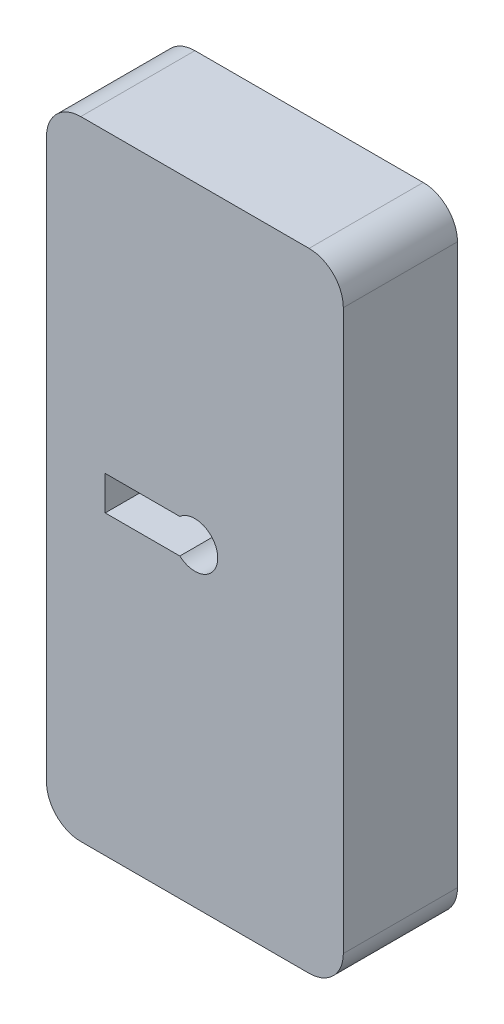
ISO-10303-21;
HEADER;
FILE_DESCRIPTION(('STEP AP214'),'2;1');
FILE_NAME('part.step','',(''),(''),'','','');
FILE_SCHEMA(('AUTOMOTIVE_DESIGN { 1 0 10303 214 1 1 1 1 }'));
ENDSEC;
DATA;
#1=APPLICATION_CONTEXT('core data for automotive mechanical design processes');
#2=APPLICATION_PROTOCOL_DEFINITION('international standard','automotive_design',2000,#1);
#3=PRODUCT_CONTEXT('',#1,'mechanical');
#4=PRODUCT('Part','Part','',(#3));
#5=PRODUCT_RELATED_PRODUCT_CATEGORY('part','',(#4));
#6=PRODUCT_DEFINITION_FORMATION('','',#4);
#7=PRODUCT_DEFINITION_CONTEXT('part definition',#1,'design');
#8=PRODUCT_DEFINITION('design','',#6,#7);
#9=PRODUCT_DEFINITION_SHAPE('','',#8);
#10=(LENGTH_UNIT() NAMED_UNIT(*) SI_UNIT(.MILLI.,.METRE.));
#11=(NAMED_UNIT(*) PLANE_ANGLE_UNIT() SI_UNIT($,.RADIAN.));
#12=(NAMED_UNIT(*) SI_UNIT($,.STERADIAN.) SOLID_ANGLE_UNIT());
#13=UNCERTAINTY_MEASURE_WITH_UNIT(LENGTH_MEASURE(1.E-05),#10,'distance_accuracy_value','');
#14=(GEOMETRIC_REPRESENTATION_CONTEXT(3) GLOBAL_UNCERTAINTY_ASSIGNED_CONTEXT((#13)) GLOBAL_UNIT_ASSIGNED_CONTEXT((#10,
#11,#12)) REPRESENTATION_CONTEXT('',''));
#15=CARTESIAN_POINT('',(0.,0.,0.));
#16=DIRECTION('',(0.,0.,1.));
#17=DIRECTION('',(1.,0.,0.));
#18=AXIS2_PLACEMENT_3D('',#15,#16,#17);
#19=CARTESIAN_POINT('',(-9.99999999999999,4.50000000000001,10.));
#20=DIRECTION('',(0.,0.,-1.));
#21=DIRECTION('',(-1.,0.,0.));
#22=AXIS2_PLACEMENT_3D('',#19,#20,#21);
#23=CYLINDRICAL_SURFACE('',#22,3.);
#24=CARTESIAN_POINT('',(-9.99999999999999,4.50000000000001,0.));
#25=DIRECTION('',(0.,0.,1.));
#26=DIRECTION('',(-1.,0.,0.));
#27=AXIS2_PLACEMENT_3D('',#24,#25,#26);
#28=CIRCLE('',#27,3.);
#29=CARTESIAN_POINT('',(-9.99999999999999,7.50000000000001,0.));
#30=VERTEX_POINT('',#29);
#31=CARTESIAN_POINT('',(-13.,4.5,0.));
#32=VERTEX_POINT('',#31);
#33=EDGE_CURVE('E185',#30,#32,#28,.T.);
#34=ORIENTED_EDGE('',*,*,#33,.T.);
#35=DIRECTION('',(0.,0.,-1.));
#36=VECTOR('',#35,1.);
#37=CARTESIAN_POINT('',(-13.,4.5,10.));
#38=LINE('',#37,#36);
#39=CARTESIAN_POINT('',(-13.,4.5,10.));
#40=VERTEX_POINT('',#39);
#41=EDGE_CURVE('E241',#40,#32,#38,.T.);
#42=ORIENTED_EDGE('',*,*,#41,.F.);
#43=CARTESIAN_POINT('',(-9.99999999999999,4.50000000000001,10.));
#44=DIRECTION('',(0.,0.,1.));
#45=DIRECTION('',(-1.,0.,0.));
#46=AXIS2_PLACEMENT_3D('',#43,#44,#45);
#47=CIRCLE('',#46,3.);
#48=CARTESIAN_POINT('',(-9.99999999999999,7.50000000000001,10.));
#49=VERTEX_POINT('',#48);
#50=EDGE_CURVE('E187',#49,#40,#47,.T.);
#51=ORIENTED_EDGE('',*,*,#50,.F.);
#52=DIRECTION('',(0.,0.,-1.));
#53=VECTOR('',#52,1.);
#54=CARTESIAN_POINT('',(-9.99999999999999,7.50000000000001,10.));
#55=LINE('',#54,#53);
#56=EDGE_CURVE('E205',#49,#30,#55,.T.);
#57=ORIENTED_EDGE('',*,*,#56,.T.);
#58=EDGE_LOOP('',(#34,#42,#51,#57));
#59=FACE_BOUND('',#58,.T.);
#60=ADVANCED_FACE('F38',(#59),#23,.T.);
#61=CARTESIAN_POINT('',(-13.,-44.5,10.));
#62=DIRECTION('',(1.,0.,0.));
#63=DIRECTION('',(0.,0.,-1.));
#64=AXIS2_PLACEMENT_3D('',#61,#62,#63);
#65=PLANE('',#64);
#66=DIRECTION('',(0.,-1.,0.));
#67=VECTOR('',#66,1.);
#68=CARTESIAN_POINT('',(-13.,-44.5,0.));
#69=LINE('',#68,#67);
#70=CARTESIAN_POINT('',(-13.,-44.5,0.));
#71=VERTEX_POINT('',#70);
#72=EDGE_CURVE('E208',#32,#71,#69,.T.);
#73=ORIENTED_EDGE('',*,*,#72,.T.);
#74=DIRECTION('',(0.,0.,-1.));
#75=VECTOR('',#74,1.);
#76=CARTESIAN_POINT('',(-13.,-44.5,10.));
#77=LINE('',#76,#75);
#78=CARTESIAN_POINT('',(-13.,-44.5,10.));
#79=VERTEX_POINT('',#78);
#80=EDGE_CURVE('E238',#79,#71,#77,.T.);
#81=ORIENTED_EDGE('',*,*,#80,.F.);
#82=DIRECTION('',(0.,-1.,0.));
#83=VECTOR('',#82,1.);
#84=CARTESIAN_POINT('',(-13.,-44.5,10.));
#85=LINE('',#84,#83);
#86=EDGE_CURVE('E190',#40,#79,#85,.T.);
#87=ORIENTED_EDGE('',*,*,#86,.F.);
#88=ORIENTED_EDGE('',*,*,#41,.T.);
#89=EDGE_LOOP('',(#73,#81,#87,#88));
#90=FACE_BOUND('',#89,.T.);
#91=ADVANCED_FACE('F270',(#90),#65,.F.);
#92=CARTESIAN_POINT('',(-9.99999999999999,-44.5,10.));
#93=DIRECTION('',(0.,0.,-1.));
#94=DIRECTION('',(-1.,0.,0.));
#95=AXIS2_PLACEMENT_3D('',#92,#93,#94);
#96=CYLINDRICAL_SURFACE('',#95,3.);
#97=CARTESIAN_POINT('',(-9.99999999999999,-44.5,0.));
#98=DIRECTION('',(0.,0.,1.));
#99=DIRECTION('',(1.,0.,0.));
#100=AXIS2_PLACEMENT_3D('',#97,#98,#99);
#101=CIRCLE('',#100,3.);
#102=CARTESIAN_POINT('',(-9.99999999999999,-47.5,0.));
#103=VERTEX_POINT('',#102);
#104=EDGE_CURVE('E210',#71,#103,#101,.T.);
#105=ORIENTED_EDGE('',*,*,#104,.T.);
#106=DIRECTION('',(0.,0.,-1.));
#107=VECTOR('',#106,1.);
#108=CARTESIAN_POINT('',(-9.99999999999999,-47.5,10.));
#109=LINE('',#108,#107);
#110=CARTESIAN_POINT('',(-9.99999999999999,-47.5,10.));
#111=VERTEX_POINT('',#110);
#112=EDGE_CURVE('E235',#111,#103,#109,.T.);
#113=ORIENTED_EDGE('',*,*,#112,.F.);
#114=CARTESIAN_POINT('',(-9.99999999999999,-44.5,10.));
#115=DIRECTION('',(0.,0.,1.));
#116=DIRECTION('',(1.,0.,0.));
#117=AXIS2_PLACEMENT_3D('',#114,#115,#116);
#118=CIRCLE('',#117,3.);
#119=EDGE_CURVE('E193',#79,#111,#118,.T.);
#120=ORIENTED_EDGE('',*,*,#119,.F.);
#121=ORIENTED_EDGE('',*,*,#80,.T.);
#122=EDGE_LOOP('',(#105,#113,#120,#121));
#123=FACE_BOUND('',#122,.T.);
#124=ADVANCED_FACE('F276',(#123),#96,.T.);
#125=CARTESIAN_POINT('',(-9.99999999999999,-47.5,10.));
#126=DIRECTION('',(0.,1.,0.));
#127=DIRECTION('',(0.,0.,1.));
#128=AXIS2_PLACEMENT_3D('',#125,#126,#127);
#129=PLANE('',#128);
#130=DIRECTION('',(1.,0.,0.));
#131=VECTOR('',#130,1.);
#132=CARTESIAN_POINT('',(-9.99999999999999,-47.5,0.));
#133=LINE('',#132,#131);
#134=CARTESIAN_POINT('',(10.,-47.5,0.));
#135=VERTEX_POINT('',#134);
#136=EDGE_CURVE('E212',#103,#135,#133,.T.);
#137=ORIENTED_EDGE('',*,*,#136,.T.);
#138=DIRECTION('',(0.,0.,-1.));
#139=VECTOR('',#138,1.);
#140=CARTESIAN_POINT('',(10.,-47.5,10.));
#141=LINE('',#140,#139);
#142=CARTESIAN_POINT('',(10.,-47.5,10.));
#143=VERTEX_POINT('',#142);
#144=EDGE_CURVE('E232',#143,#135,#141,.T.);
#145=ORIENTED_EDGE('',*,*,#144,.F.);
#146=DIRECTION('',(1.,0.,0.));
#147=VECTOR('',#146,1.);
#148=CARTESIAN_POINT('',(-9.99999999999999,-47.5,10.));
#149=LINE('',#148,#147);
#150=EDGE_CURVE('E195',#111,#143,#149,.T.);
#151=ORIENTED_EDGE('',*,*,#150,.F.);
#152=ORIENTED_EDGE('',*,*,#112,.T.);
#153=EDGE_LOOP('',(#137,#145,#151,#152));
#154=FACE_BOUND('',#153,.T.);
#155=ADVANCED_FACE('F282',(#154),#129,.F.);
#156=CARTESIAN_POINT('',(10.,-44.5,10.));
#157=DIRECTION('',(0.,0.,-1.));
#158=DIRECTION('',(-1.,0.,0.));
#159=AXIS2_PLACEMENT_3D('',#156,#157,#158);
#160=CYLINDRICAL_SURFACE('',#159,3.);
#161=CARTESIAN_POINT('',(10.,-44.5,0.));
#162=DIRECTION('',(0.,0.,1.));
#163=DIRECTION('',(-1.,0.,0.));
#164=AXIS2_PLACEMENT_3D('',#161,#162,#163);
#165=CIRCLE('',#164,3.);
#166=CARTESIAN_POINT('',(13.,-44.5,0.));
#167=VERTEX_POINT('',#166);
#168=EDGE_CURVE('E214',#135,#167,#165,.T.);
#169=ORIENTED_EDGE('',*,*,#168,.T.);
#170=DIRECTION('',(0.,0.,-1.));
#171=VECTOR('',#170,1.);
#172=CARTESIAN_POINT('',(13.,-44.5,10.));
#173=LINE('',#172,#171);
#174=CARTESIAN_POINT('',(13.,-44.5,10.));
#175=VERTEX_POINT('',#174);
#176=EDGE_CURVE('E229',#175,#167,#173,.T.);
#177=ORIENTED_EDGE('',*,*,#176,.F.);
#178=CARTESIAN_POINT('',(10.,-44.5,10.));
#179=DIRECTION('',(0.,0.,1.));
#180=DIRECTION('',(-1.,0.,0.));
#181=AXIS2_PLACEMENT_3D('',#178,#179,#180);
#182=CIRCLE('',#181,3.);
#183=EDGE_CURVE('E197',#143,#175,#182,.T.);
#184=ORIENTED_EDGE('',*,*,#183,.F.);
#185=ORIENTED_EDGE('',*,*,#144,.T.);
#186=EDGE_LOOP('',(#169,#177,#184,#185));
#187=FACE_BOUND('',#186,.T.);
#188=ADVANCED_FACE('F286',(#187),#160,.T.);
#189=CARTESIAN_POINT('',(13.,-44.5,10.));
#190=DIRECTION('',(-1.,0.,0.));
#191=DIRECTION('',(0.,0.,1.));
#192=AXIS2_PLACEMENT_3D('',#189,#190,#191);
#193=PLANE('',#192);
#194=DIRECTION('',(0.,1.,0.));
#195=VECTOR('',#194,1.);
#196=CARTESIAN_POINT('',(13.,-44.5,0.));
#197=LINE('',#196,#195);
#198=CARTESIAN_POINT('',(13.,4.5,0.));
#199=VERTEX_POINT('',#198);
#200=EDGE_CURVE('E216',#167,#199,#197,.T.);
#201=ORIENTED_EDGE('',*,*,#200,.T.);
#202=DIRECTION('',(0.,0.,-1.));
#203=VECTOR('',#202,1.);
#204=CARTESIAN_POINT('',(13.,4.5,10.));
#205=LINE('',#204,#203);
#206=CARTESIAN_POINT('',(13.,4.5,10.));
#207=VERTEX_POINT('',#206);
#208=EDGE_CURVE('E226',#207,#199,#205,.T.);
#209=ORIENTED_EDGE('',*,*,#208,.F.);
#210=DIRECTION('',(0.,1.,0.));
#211=VECTOR('',#210,1.);
#212=CARTESIAN_POINT('',(13.,-44.5,10.));
#213=LINE('',#212,#211);
#214=EDGE_CURVE('E199',#175,#207,#213,.T.);
#215=ORIENTED_EDGE('',*,*,#214,.F.);
#216=ORIENTED_EDGE('',*,*,#176,.T.);
#217=EDGE_LOOP('',(#201,#209,#215,#216));
#218=FACE_BOUND('',#217,.T.);
#219=ADVANCED_FACE('F290',(#218),#193,.F.);
#220=CARTESIAN_POINT('',(10.,4.50000000000001,10.));
#221=DIRECTION('',(0.,0.,-1.));
#222=DIRECTION('',(-1.,0.,0.));
#223=AXIS2_PLACEMENT_3D('',#220,#221,#222);
#224=CYLINDRICAL_SURFACE('',#223,3.);
#225=CARTESIAN_POINT('',(10.,4.50000000000001,0.));
#226=DIRECTION('',(0.,0.,1.));
#227=DIRECTION('',(-1.,0.,0.));
#228=AXIS2_PLACEMENT_3D('',#225,#226,#227);
#229=CIRCLE('',#228,3.);
#230=CARTESIAN_POINT('',(10.,7.50000000000001,0.));
#231=VERTEX_POINT('',#230);
#232=EDGE_CURVE('E218',#199,#231,#229,.T.);
#233=ORIENTED_EDGE('',*,*,#232,.T.);
#234=DIRECTION('',(0.,0.,-1.));
#235=VECTOR('',#234,1.);
#236=CARTESIAN_POINT('',(10.,7.50000000000001,10.));
#237=LINE('',#236,#235);
#238=CARTESIAN_POINT('',(10.,7.50000000000001,10.));
#239=VERTEX_POINT('',#238);
#240=EDGE_CURVE('E223',#239,#231,#237,.T.);
#241=ORIENTED_EDGE('',*,*,#240,.F.);
#242=CARTESIAN_POINT('',(10.,4.50000000000001,10.));
#243=DIRECTION('',(0.,0.,1.));
#244=DIRECTION('',(-1.,0.,0.));
#245=AXIS2_PLACEMENT_3D('',#242,#243,#244);
#246=CIRCLE('',#245,3.);
#247=EDGE_CURVE('E201',#207,#239,#246,.T.);
#248=ORIENTED_EDGE('',*,*,#247,.F.);
#249=ORIENTED_EDGE('',*,*,#208,.T.);
#250=EDGE_LOOP('',(#233,#241,#248,#249));
#251=FACE_BOUND('',#250,.T.);
#252=ADVANCED_FACE('F294',(#251),#224,.T.);
#253=CARTESIAN_POINT('',(-9.99999999999999,7.50000000000001,10.));
#254=DIRECTION('',(0.,-1.,0.));
#255=DIRECTION('',(0.,0.,-1.));
#256=AXIS2_PLACEMENT_3D('',#253,#254,#255);
#257=PLANE('',#256);
#258=DIRECTION('',(-1.,0.,0.));
#259=VECTOR('',#258,1.);
#260=CARTESIAN_POINT('',(-9.99999999999999,7.50000000000001,0.));
#261=LINE('',#260,#259);
#262=EDGE_CURVE('E191',#231,#30,#261,.T.);
#263=ORIENTED_EDGE('',*,*,#262,.T.);
#264=ORIENTED_EDGE('',*,*,#56,.F.);
#265=DIRECTION('',(-1.,0.,0.));
#266=VECTOR('',#265,1.);
#267=CARTESIAN_POINT('',(-9.99999999999999,7.50000000000001,10.));
#268=LINE('',#267,#266);
#269=EDGE_CURVE('E203',#239,#49,#268,.T.);
#270=ORIENTED_EDGE('',*,*,#269,.F.);
#271=ORIENTED_EDGE('',*,*,#240,.T.);
#272=EDGE_LOOP('',(#263,#264,#270,#271));
#273=FACE_BOUND('',#272,.T.);
#274=ADVANCED_FACE('F298',(#273),#257,.F.);
#275=CARTESIAN_POINT('',(-9.99999999999999,4.50000000000001,10.));
#276=DIRECTION('',(0.,0.,-1.));
#277=DIRECTION('',(-1.,0.,0.));
#278=AXIS2_PLACEMENT_3D('',#275,#276,#277);
#279=PLANE('',#278);
#280=DIRECTION('',(0.,-1.,0.));
#281=VECTOR('',#280,1.);
#282=CARTESIAN_POINT('',(-7.85811682286003,-18.5,10.));
#283=LINE('',#282,#281);
#284=CARTESIAN_POINT('',(-7.85811682286003,-18.5,10.));
#285=VERTEX_POINT('',#284);
#286=CARTESIAN_POINT('',(-7.85811682286003,-21.5,10.));
#287=VERTEX_POINT('',#286);
#288=EDGE_CURVE('E165',#285,#287,#283,.T.);
#289=ORIENTED_EDGE('',*,*,#288,.F.);
#290=DIRECTION('',(-1.,0.,0.));
#291=VECTOR('',#290,1.);
#292=CARTESIAN_POINT('',(-1.32287565553224,-18.5,10.));
#293=LINE('',#292,#291);
#294=CARTESIAN_POINT('',(-1.32287565553224,-18.5,10.));
#295=VERTEX_POINT('',#294);
#296=EDGE_CURVE('E156',#295,#285,#293,.T.);
#297=ORIENTED_EDGE('',*,*,#296,.F.);
#298=CARTESIAN_POINT('',(0.,-20.,10.));
#299=DIRECTION('',(0.,0.,1.));
#300=DIRECTION('',(1.,0.,0.));
#301=AXIS2_PLACEMENT_3D('',#298,#299,#300);
#302=CIRCLE('',#301,1.99999999999997);
#303=CARTESIAN_POINT('',(-1.32287565553224,-21.5,10.));
#304=VERTEX_POINT('',#303);
#305=EDGE_CURVE('E169',#304,#295,#302,.T.);
#306=ORIENTED_EDGE('',*,*,#305,.F.);
#307=DIRECTION('',(1.,0.,0.));
#308=VECTOR('',#307,1.);
#309=CARTESIAN_POINT('',(-7.85811682286003,-21.5,10.));
#310=LINE('',#309,#308);
#311=EDGE_CURVE('E53',#287,#304,#310,.T.);
#312=ORIENTED_EDGE('',*,*,#311,.F.);
#313=EDGE_LOOP('',(#289,#297,#306,#312));
#314=FACE_BOUND('',#313,.T.);
#315=ORIENTED_EDGE('',*,*,#50,.T.);
#316=ORIENTED_EDGE('',*,*,#86,.T.);
#317=ORIENTED_EDGE('',*,*,#119,.T.);
#318=ORIENTED_EDGE('',*,*,#150,.T.);
#319=ORIENTED_EDGE('',*,*,#183,.T.);
#320=ORIENTED_EDGE('',*,*,#214,.T.);
#321=ORIENTED_EDGE('',*,*,#247,.T.);
#322=ORIENTED_EDGE('',*,*,#269,.T.);
#323=EDGE_LOOP('',(#315,#316,#317,#318,#319,#320,#321,#322));
#324=FACE_BOUND('',#323,.T.);
#325=ADVANCED_FACE('F302',(#314,#324),#279,.F.);
#326=CARTESIAN_POINT('',(-9.99999999999999,4.50000000000001,0.));
#327=DIRECTION('',(0.,0.,-1.));
#328=DIRECTION('',(-1.,0.,0.));
#329=AXIS2_PLACEMENT_3D('',#326,#327,#328);
#330=PLANE('',#329);
#331=CARTESIAN_POINT('',(-1.08081316866238E-13,-5.5000000000001,0.));
#332=DIRECTION('',(0.,0.,-1.));
#333=DIRECTION('',(-1.,0.,0.));
#334=AXIS2_PLACEMENT_3D('',#331,#332,#333);
#335=CIRCLE('',#334,1.64999999977116);
#336=CARTESIAN_POINT('',(-1.64999999977127,-5.5000000000001,0.));
#337=VERTEX_POINT('',#336);
#338=EDGE_CURVE('E342',#337,#337,#335,.T.);
#339=ORIENTED_EDGE('',*,*,#338,.F.);
#340=EDGE_LOOP('',(#339));
#341=FACE_BOUND('',#340,.T.);
#342=CARTESIAN_POINT('',(-1.08081316866238E-13,-9.0000000000001,0.));
#343=DIRECTION('',(0.,0.,-1.));
#344=DIRECTION('',(-1.,0.,0.));
#345=AXIS2_PLACEMENT_3D('',#342,#343,#344);
#346=CIRCLE('',#345,1.64999999977116);
#347=CARTESIAN_POINT('',(-1.64999999977127,-9.0000000000001,0.));
#348=VERTEX_POINT('',#347);
#349=EDGE_CURVE('E343',#348,#348,#346,.T.);
#350=ORIENTED_EDGE('',*,*,#349,.F.);
#351=EDGE_LOOP('',(#350));
#352=FACE_BOUND('',#351,.T.);
#353=CARTESIAN_POINT('',(-1.08509943245928E-13,-12.5000000000001,0.));
#354=DIRECTION('',(0.,0.,-1.));
#355=DIRECTION('',(-1.,0.,0.));
#356=AXIS2_PLACEMENT_3D('',#353,#354,#355);
#357=CIRCLE('',#356,1.64999999977116);
#358=CARTESIAN_POINT('',(-1.64999999977127,-12.5000000000001,0.));
#359=VERTEX_POINT('',#358);
#360=EDGE_CURVE('E346',#359,#359,#357,.T.);
#361=ORIENTED_EDGE('',*,*,#360,.F.);
#362=EDGE_LOOP('',(#361));
#363=FACE_BOUND('',#362,.T.);
#364=DIRECTION('',(-1.,0.,0.));
#365=VECTOR('',#364,1.);
#366=CARTESIAN_POINT('',(-1.32287565553224,-18.5,0.));
#367=LINE('',#366,#365);
#368=CARTESIAN_POINT('',(-3.70809924354796,-18.5,0.));
#369=VERTEX_POINT('',#368);
#370=CARTESIAN_POINT('',(-7.85811682286003,-18.5,0.));
#371=VERTEX_POINT('',#370);
#372=EDGE_CURVE('E153',#369,#371,#367,.T.);
#373=ORIENTED_EDGE('',*,*,#372,.T.);
#374=DIRECTION('',(0.,-1.,0.));
#375=VECTOR('',#374,1.);
#376=CARTESIAN_POINT('',(-7.85811682286003,-18.5,0.));
#377=LINE('',#376,#375);
#378=CARTESIAN_POINT('',(-7.85811682286003,-21.5,0.));
#379=VERTEX_POINT('',#378);
#380=EDGE_CURVE('E140',#371,#379,#377,.T.);
#381=ORIENTED_EDGE('',*,*,#380,.T.);
#382=DIRECTION('',(1.,0.,0.));
#383=VECTOR('',#382,1.);
#384=CARTESIAN_POINT('',(-7.85811682286003,-21.5,0.));
#385=LINE('',#384,#383);
#386=CARTESIAN_POINT('',(-3.70809924354796,-21.5,0.));
#387=VERTEX_POINT('',#386);
#388=EDGE_CURVE('E171',#379,#387,#385,.T.);
#389=ORIENTED_EDGE('',*,*,#388,.T.);
#390=CARTESIAN_POINT('',(0.,-20.,0.));
#391=DIRECTION('',(0.,0.,-1.));
#392=DIRECTION('',(-1.,0.,0.));
#393=AXIS2_PLACEMENT_3D('',#390,#391,#392);
#394=CIRCLE('',#393,4.00000000000006);
#395=EDGE_CURVE('E163',#369,#387,#394,.T.);
#396=ORIENTED_EDGE('',*,*,#395,.F.);
#397=EDGE_LOOP('',(#373,#381,#389,#396));
#398=FACE_BOUND('',#397,.T.);
#399=ORIENTED_EDGE('',*,*,#33,.F.);
#400=ORIENTED_EDGE('',*,*,#262,.F.);
#401=ORIENTED_EDGE('',*,*,#232,.F.);
#402=ORIENTED_EDGE('',*,*,#200,.F.);
#403=ORIENTED_EDGE('',*,*,#168,.F.);
#404=ORIENTED_EDGE('',*,*,#136,.F.);
#405=ORIENTED_EDGE('',*,*,#104,.F.);
#406=ORIENTED_EDGE('',*,*,#72,.F.);
#407=EDGE_LOOP('',(#399,#400,#401,#402,#403,#404,#405,#406));
#408=FACE_BOUND('',#407,.T.);
#409=ADVANCED_FACE('F160',(#341,#352,#363,#398,#408),#330,.T.);
#410=CARTESIAN_POINT('',(0.,-20.,5.));
#411=DIRECTION('',(0.,0.,-1.));
#412=DIRECTION('',(-1.,0.,0.));
#413=AXIS2_PLACEMENT_3D('',#410,#411,#412);
#414=CYLINDRICAL_SURFACE('',#413,4.00000000000006);
#415=CARTESIAN_POINT('',(0.,-20.,5.));
#416=DIRECTION('',(0.,0.,-1.));
#417=DIRECTION('',(-1.,0.,0.));
#418=AXIS2_PLACEMENT_3D('',#415,#416,#417);
#419=CIRCLE('',#418,4.00000000000006);
#420=CARTESIAN_POINT('',(-3.70809924354796,-18.5,5.));
#421=VERTEX_POINT('',#420);
#422=CARTESIAN_POINT('',(-3.70809924354796,-21.5,5.));
#423=VERTEX_POINT('',#422);
#424=EDGE_CURVE('E182',#421,#423,#419,.T.);
#425=ORIENTED_EDGE('',*,*,#424,.F.);
#426=DIRECTION('',(0.,0.,-1.));
#427=VECTOR('',#426,1.);
#428=CARTESIAN_POINT('',(-3.70809924354796,-18.5,5.));
#429=LINE('',#428,#427);
#430=EDGE_CURVE('E180',#421,#369,#429,.T.);
#431=ORIENTED_EDGE('',*,*,#430,.T.);
#432=ORIENTED_EDGE('',*,*,#395,.T.);
#433=DIRECTION('',(0.,0.,-1.));
#434=VECTOR('',#433,1.);
#435=CARTESIAN_POINT('',(-3.70809924354796,-21.5,5.));
#436=LINE('',#435,#434);
#437=EDGE_CURVE('E177',#387,#423,#436,.F.);
#438=ORIENTED_EDGE('',*,*,#437,.T.);
#439=EDGE_LOOP('',(#425,#431,#432,#438));
#440=FACE_BOUND('',#439,.T.);
#441=ADVANCED_FACE('F306',(#440),#414,.F.);
#442=CARTESIAN_POINT('',(0.,-20.,5.));
#443=DIRECTION('',(0.,0.,-1.));
#444=DIRECTION('',(-1.,0.,0.));
#445=AXIS2_PLACEMENT_3D('',#442,#443,#444);
#446=PLANE('',#445);
#447=DIRECTION('',(1.,0.,0.));
#448=VECTOR('',#447,1.);
#449=CARTESIAN_POINT('',(0.,-18.5,5.));
#450=LINE('',#449,#448);
#451=CARTESIAN_POINT('',(-1.32287565553224,-18.5,5.));
#452=VERTEX_POINT('',#451);
#453=EDGE_CURVE('E248',#421,#452,#450,.T.);
#454=ORIENTED_EDGE('',*,*,#453,.F.);
#455=ORIENTED_EDGE('',*,*,#424,.T.);
#456=DIRECTION('',(-1.,0.,0.));
#457=VECTOR('',#456,1.);
#458=CARTESIAN_POINT('',(0.,-21.5,5.));
#459=LINE('',#458,#457);
#460=CARTESIAN_POINT('',(-1.32287565553224,-21.5,5.));
#461=VERTEX_POINT('',#460);
#462=EDGE_CURVE('E246',#461,#423,#459,.T.);
#463=ORIENTED_EDGE('',*,*,#462,.F.);
#464=CARTESIAN_POINT('',(0.,-20.,5.));
#465=DIRECTION('',(0.,0.,-1.));
#466=DIRECTION('',(-1.,0.,0.));
#467=AXIS2_PLACEMENT_3D('',#464,#465,#466);
#468=CIRCLE('',#467,1.99999999999997);
#469=EDGE_CURVE('E244',#452,#461,#468,.T.);
#470=ORIENTED_EDGE('',*,*,#469,.F.);
#471=EDGE_LOOP('',(#454,#455,#463,#470));
#472=FACE_BOUND('',#471,.T.);
#473=ADVANCED_FACE('F313',(#472),#446,.T.);
#474=CARTESIAN_POINT('',(-1.32287565553224,-18.5,-10.6387248903783));
#475=DIRECTION('',(0.,1.,0.));
#476=DIRECTION('',(0.,0.,1.));
#477=AXIS2_PLACEMENT_3D('',#474,#475,#476);
#478=PLANE('',#477);
#479=ORIENTED_EDGE('',*,*,#453,.T.);
#480=DIRECTION('',(0.,0.,1.));
#481=VECTOR('',#480,1.);
#482=CARTESIAN_POINT('',(-1.32287565553224,-18.5,-10.6387248903783));
#483=LINE('',#482,#481);
#484=EDGE_CURVE('E61',#452,#295,#483,.T.);
#485=ORIENTED_EDGE('',*,*,#484,.T.);
#486=ORIENTED_EDGE('',*,*,#296,.T.);
#487=DIRECTION('',(0.,0.,1.));
#488=VECTOR('',#487,1.);
#489=CARTESIAN_POINT('',(-7.85811682286003,-18.5,-10.6387248903783));
#490=LINE('',#489,#488);
#491=EDGE_CURVE('E144',#371,#285,#490,.T.);
#492=ORIENTED_EDGE('',*,*,#491,.F.);
#493=ORIENTED_EDGE('',*,*,#372,.F.);
#494=ORIENTED_EDGE('',*,*,#430,.F.);
#495=EDGE_LOOP('',(#479,#485,#486,#492,#493,#494));
#496=FACE_BOUND('',#495,.T.);
#497=ADVANCED_FACE('F152',(#496),#478,.F.);
#498=CARTESIAN_POINT('',(-7.85811682286003,-21.5,-10.6387248903783));
#499=DIRECTION('',(0.,-1.,0.));
#500=DIRECTION('',(0.,0.,-1.));
#501=AXIS2_PLACEMENT_3D('',#498,#499,#500);
#502=PLANE('',#501);
#503=ORIENTED_EDGE('',*,*,#388,.F.);
#504=DIRECTION('',(0.,0.,1.));
#505=VECTOR('',#504,1.);
#506=CARTESIAN_POINT('',(-7.85811682286003,-21.5,-10.6387248903783));
#507=LINE('',#506,#505);
#508=EDGE_CURVE('E146',#379,#287,#507,.T.);
#509=ORIENTED_EDGE('',*,*,#508,.T.);
#510=ORIENTED_EDGE('',*,*,#311,.T.);
#511=DIRECTION('',(0.,0.,1.));
#512=VECTOR('',#511,1.);
#513=CARTESIAN_POINT('',(-1.32287565553224,-21.5,-10.6387248903783));
#514=LINE('',#513,#512);
#515=EDGE_CURVE('E172',#461,#304,#514,.T.);
#516=ORIENTED_EDGE('',*,*,#515,.F.);
#517=ORIENTED_EDGE('',*,*,#462,.T.);
#518=ORIENTED_EDGE('',*,*,#437,.F.);
#519=EDGE_LOOP('',(#503,#509,#510,#516,#517,#518));
#520=FACE_BOUND('',#519,.T.);
#521=ADVANCED_FACE('F320',(#520),#502,.F.);
#522=CARTESIAN_POINT('',(-7.85811682286003,-18.5,-10.6387248903783));
#523=DIRECTION('',(-1.,0.,0.));
#524=DIRECTION('',(0.,0.,1.));
#525=AXIS2_PLACEMENT_3D('',#522,#523,#524);
#526=PLANE('',#525);
#527=ORIENTED_EDGE('',*,*,#491,.T.);
#528=ORIENTED_EDGE('',*,*,#288,.T.);
#529=ORIENTED_EDGE('',*,*,#508,.F.);
#530=ORIENTED_EDGE('',*,*,#380,.F.);
#531=EDGE_LOOP('',(#527,#528,#529,#530));
#532=FACE_BOUND('',#531,.T.);
#533=ADVANCED_FACE('F142',(#532),#526,.F.);
#534=CARTESIAN_POINT('',(0.,-20.,-10.6387248903783));
#535=DIRECTION('',(0.,0.,1.));
#536=DIRECTION('',(1.,0.,0.));
#537=AXIS2_PLACEMENT_3D('',#534,#535,#536);
#538=CYLINDRICAL_SURFACE('',#537,1.99999999999997);
#539=ORIENTED_EDGE('',*,*,#469,.T.);
#540=ORIENTED_EDGE('',*,*,#515,.T.);
#541=ORIENTED_EDGE('',*,*,#305,.T.);
#542=ORIENTED_EDGE('',*,*,#484,.F.);
#543=EDGE_LOOP('',(#539,#540,#541,#542));
#544=FACE_BOUND('',#543,.T.);
#545=ADVANCED_FACE('F323',(#544),#538,.F.);
#546=CARTESIAN_POINT('',(-1.08509943245928E-13,-12.5000000000001,3.3));
#547=DIRECTION('',(0.,0.,-1.));
#548=DIRECTION('',(-1.,0.,0.));
#549=AXIS2_PLACEMENT_3D('',#546,#547,#548);
#550=CYLINDRICAL_SURFACE('',#549,1.64999999977116);
#551=CARTESIAN_POINT('',(-1.08509943245928E-13,-12.5000000000001,1.65));
#552=DIRECTION('',(0.,0.,-1.));
#553=DIRECTION('',(-1.,0.,0.));
#554=AXIS2_PLACEMENT_3D('',#551,#552,#553);
#555=CIRCLE('',#554,1.64999999977116);
#556=CARTESIAN_POINT('',(-1.64999999977127,-12.5000000000001,1.65));
#557=VERTEX_POINT('',#556);
#558=EDGE_CURVE('E250',#557,#557,#555,.F.);
#559=ORIENTED_EDGE('',*,*,#558,.T.);
#560=EDGE_LOOP('',(#559));
#561=FACE_BOUND('',#560,.T.);
#562=ORIENTED_EDGE('',*,*,#360,.T.);
#563=EDGE_LOOP('',(#562));
#564=FACE_BOUND('',#563,.T.);
#565=ADVANCED_FACE('F328',(#561,#564),#550,.F.);
#566=CARTESIAN_POINT('',(-1.08081316866238E-13,-9.0000000000001,3.3));
#567=DIRECTION('',(0.,0.,-1.));
#568=DIRECTION('',(-1.,0.,0.));
#569=AXIS2_PLACEMENT_3D('',#566,#567,#568);
#570=CYLINDRICAL_SURFACE('',#569,1.64999999977116);
#571=CARTESIAN_POINT('',(-1.08081316866238E-13,-9.0000000000001,1.65));
#572=DIRECTION('',(0.,0.,-1.));
#573=DIRECTION('',(-1.,0.,0.));
#574=AXIS2_PLACEMENT_3D('',#571,#572,#573);
#575=CIRCLE('',#574,1.64999999977116);
#576=CARTESIAN_POINT('',(-1.64999999977127,-9.0000000000001,1.65));
#577=VERTEX_POINT('',#576);
#578=EDGE_CURVE('E46',#577,#577,#575,.F.);
#579=ORIENTED_EDGE('',*,*,#578,.T.);
#580=EDGE_LOOP('',(#579));
#581=FACE_BOUND('',#580,.T.);
#582=ORIENTED_EDGE('',*,*,#349,.T.);
#583=EDGE_LOOP('',(#582));
#584=FACE_BOUND('',#583,.T.);
#585=ADVANCED_FACE('F255',(#581,#584),#570,.F.);
#586=CARTESIAN_POINT('',(-1.08081316866238E-13,-5.5000000000001,3.3));
#587=DIRECTION('',(0.,0.,-1.));
#588=DIRECTION('',(-1.,0.,0.));
#589=AXIS2_PLACEMENT_3D('',#586,#587,#588);
#590=CYLINDRICAL_SURFACE('',#589,1.64999999977116);
#591=CARTESIAN_POINT('',(-1.08081316866238E-13,-5.5000000000001,1.65));
#592=DIRECTION('',(0.,0.,-1.));
#593=DIRECTION('',(-1.,0.,0.));
#594=AXIS2_PLACEMENT_3D('',#591,#592,#593);
#595=CIRCLE('',#594,1.64999999977116);
#596=CARTESIAN_POINT('',(-1.64999999977127,-5.5000000000001,1.65));
#597=VERTEX_POINT('',#596);
#598=EDGE_CURVE('E11',#597,#597,#595,.F.);
#599=ORIENTED_EDGE('',*,*,#598,.T.);
#600=EDGE_LOOP('',(#599));
#601=FACE_BOUND('',#600,.T.);
#602=ORIENTED_EDGE('',*,*,#338,.T.);
#603=EDGE_LOOP('',(#602));
#604=FACE_BOUND('',#603,.T.);
#605=ADVANCED_FACE('F266',(#601,#604),#590,.F.);
#606=CARTESIAN_POINT('',(-1.08509943245928E-13,-12.5000000000001,1.65));
#607=DIRECTION('',(0.,0.,-1.));
#608=DIRECTION('',(-1.,0.,0.));
#609=AXIS2_PLACEMENT_3D('',#606,#607,#608);
#610=SPHERICAL_SURFACE('',#609,1.65);
#611=ORIENTED_EDGE('',*,*,#558,.F.);
#612=EDGE_LOOP('',(#611));
#613=FACE_BOUND('',#612,.T.);
#614=ADVANCED_FACE('F260',(#613),#610,.F.);
#615=CARTESIAN_POINT('',(-1.08081316866238E-13,-9.0000000000001,1.65));
#616=DIRECTION('',(0.,0.,-1.));
#617=DIRECTION('',(-1.,0.,0.));
#618=AXIS2_PLACEMENT_3D('',#615,#616,#617);
#619=SPHERICAL_SURFACE('',#618,1.65);
#620=ORIENTED_EDGE('',*,*,#578,.F.);
#621=EDGE_LOOP('',(#620));
#622=FACE_BOUND('',#621,.T.);
#623=ADVANCED_FACE('F258',(#622),#619,.F.);
#624=CARTESIAN_POINT('',(-1.08081316866238E-13,-5.5000000000001,1.65));
#625=DIRECTION('',(0.,0.,-1.));
#626=DIRECTION('',(-1.,0.,0.));
#627=AXIS2_PLACEMENT_3D('',#624,#625,#626);
#628=SPHERICAL_SURFACE('',#627,1.65);
#629=ORIENTED_EDGE('',*,*,#598,.F.);
#630=EDGE_LOOP('',(#629));
#631=FACE_BOUND('',#630,.T.);
#632=ADVANCED_FACE('F40',(#631),#628,.F.);
#633=CLOSED_SHELL('',(#60,#91,#124,#155,#188,#219,#252,#274,#325,#409,#441,#473,#497,#521,#533,
#545,#565,#585,#605,#614,#623,#632));
#634=MANIFOLD_SOLID_BREP('B2',#633);
#635=ADVANCED_BREP_SHAPE_REPRESENTATION('',(#18,#634),#14);
#636=SHAPE_DEFINITION_REPRESENTATION(#9,#635);
ENDSEC;
END-ISO-10303-21;
